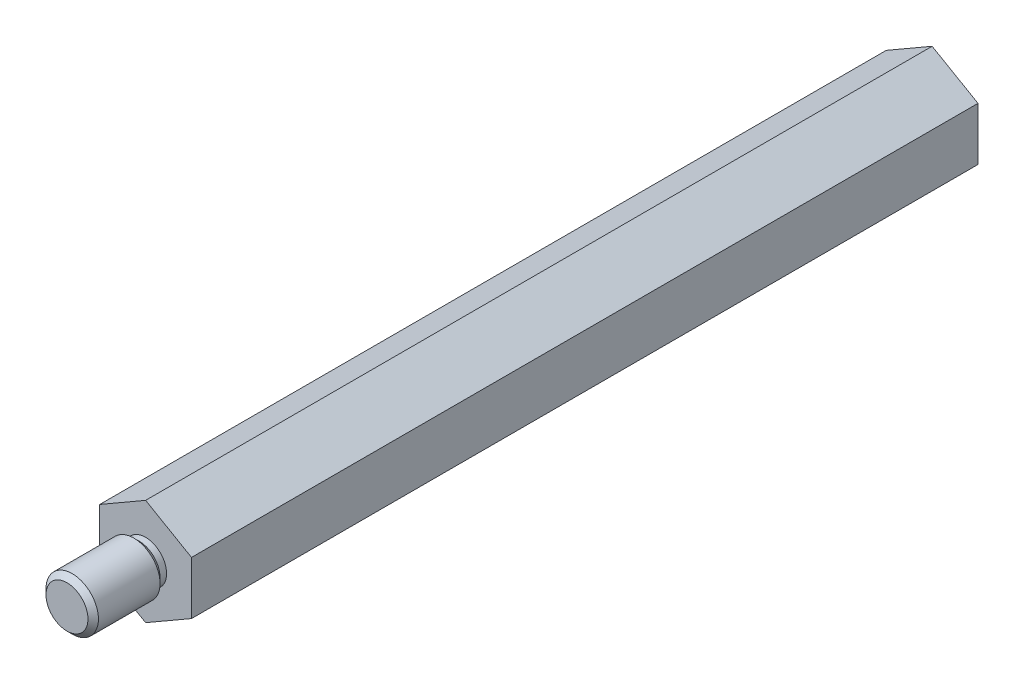
ISO-10303-21;
HEADER;
FILE_DESCRIPTION(('STEP AP214'),'2;1');
FILE_NAME('part.step','',(''),(''),'','','');
FILE_SCHEMA(('AUTOMOTIVE_DESIGN { 1 0 10303 214 1 1 1 1 }'));
ENDSEC;
DATA;
#1=APPLICATION_CONTEXT('core data for automotive mechanical design processes');
#2=APPLICATION_PROTOCOL_DEFINITION('international standard','automotive_design',2000,#1);
#3=PRODUCT_CONTEXT('',#1,'mechanical');
#4=PRODUCT('Part','Part','',(#3));
#5=PRODUCT_RELATED_PRODUCT_CATEGORY('part','',(#4));
#6=PRODUCT_DEFINITION_FORMATION('','',#4);
#7=PRODUCT_DEFINITION_CONTEXT('part definition',#1,'design');
#8=PRODUCT_DEFINITION('design','',#6,#7);
#9=PRODUCT_DEFINITION_SHAPE('','',#8);
#10=(LENGTH_UNIT() NAMED_UNIT(*) SI_UNIT(.MILLI.,.METRE.));
#11=(NAMED_UNIT(*) PLANE_ANGLE_UNIT() SI_UNIT($,.RADIAN.));
#12=(NAMED_UNIT(*) SI_UNIT($,.STERADIAN.) SOLID_ANGLE_UNIT());
#13=UNCERTAINTY_MEASURE_WITH_UNIT(LENGTH_MEASURE(1.E-05),#10,'distance_accuracy_value','');
#14=(GEOMETRIC_REPRESENTATION_CONTEXT(3) GLOBAL_UNCERTAINTY_ASSIGNED_CONTEXT((#13)) GLOBAL_UNIT_ASSIGNED_CONTEXT((#10,
#11,#12)) REPRESENTATION_CONTEXT('',''));
#15=CARTESIAN_POINT('',(0.,0.,0.));
#16=DIRECTION('',(0.,0.,1.));
#17=DIRECTION('',(1.,0.,0.));
#18=AXIS2_PLACEMENT_3D('',#15,#16,#17);
#19=CARTESIAN_POINT('',(0.,4.04145188432737,60.));
#20=DIRECTION('',(0.,0.,1.));
#21=DIRECTION('',(1.,0.,0.));
#22=AXIS2_PLACEMENT_3D('',#19,#20,#21);
#23=PLANE('',#22);
#24=DIRECTION('',(-0.866025403784438,0.5,0.));
#25=VECTOR('',#24,1.);
#26=CARTESIAN_POINT('',(3.49999999999999,2.02072594216368,60.));
#27=LINE('',#26,#25);
#28=CARTESIAN_POINT('',(3.49999999999999,2.02072594216368,60.));
#29=VERTEX_POINT('',#28);
#30=CARTESIAN_POINT('',(0.,4.04145188432737,60.));
#31=VERTEX_POINT('',#30);
#32=EDGE_CURVE('E131',#29,#31,#27,.T.);
#33=ORIENTED_EDGE('',*,*,#32,.T.);
#34=DIRECTION('',(-0.866025403784438,-0.5,0.));
#35=VECTOR('',#34,1.);
#36=CARTESIAN_POINT('',(0.,4.04145188432737,60.));
#37=LINE('',#36,#35);
#38=CARTESIAN_POINT('',(-3.5,2.02072594216368,60.));
#39=VERTEX_POINT('',#38);
#40=EDGE_CURVE('E88',#31,#39,#37,.T.);
#41=ORIENTED_EDGE('',*,*,#40,.T.);
#42=DIRECTION('',(0.,-1.,0.));
#43=VECTOR('',#42,1.);
#44=CARTESIAN_POINT('',(-3.5,2.02072594216368,60.));
#45=LINE('',#44,#43);
#46=CARTESIAN_POINT('',(-3.5,-2.0207259421637,60.));
#47=VERTEX_POINT('',#46);
#48=EDGE_CURVE('E102',#39,#47,#45,.T.);
#49=ORIENTED_EDGE('',*,*,#48,.T.);
#50=DIRECTION('',(0.866025403784438,-0.5,0.));
#51=VECTOR('',#50,1.);
#52=CARTESIAN_POINT('',(-3.5,-2.0207259421637,60.));
#53=LINE('',#52,#51);
#54=CARTESIAN_POINT('',(0.,-4.04145188432739,60.));
#55=VERTEX_POINT('',#54);
#56=EDGE_CURVE('E96',#47,#55,#53,.T.);
#57=ORIENTED_EDGE('',*,*,#56,.T.);
#58=DIRECTION('',(0.866025403784439,0.5,0.));
#59=VECTOR('',#58,1.);
#60=CARTESIAN_POINT('',(0.,-4.04145188432739,60.));
#61=LINE('',#60,#59);
#62=CARTESIAN_POINT('',(3.49999999999999,-2.0207259421637,60.));
#63=VERTEX_POINT('',#62);
#64=EDGE_CURVE('E100',#55,#63,#61,.T.);
#65=ORIENTED_EDGE('',*,*,#64,.T.);
#66=DIRECTION('',(0.,1.,0.));
#67=VECTOR('',#66,1.);
#68=CARTESIAN_POINT('',(3.49999999999999,-2.0207259421637,60.));
#69=LINE('',#68,#67);
#70=EDGE_CURVE('E49',#63,#29,#69,.T.);
#71=ORIENTED_EDGE('',*,*,#70,.T.);
#72=EDGE_LOOP('',(#33,#41,#49,#57,#65,#71));
#73=FACE_BOUND('',#72,.T.);
#74=CARTESIAN_POINT('',(0.,0.,60.));
#75=DIRECTION('',(0.,0.,1.));
#76=DIRECTION('',(1.,0.,0.));
#77=AXIS2_PLACEMENT_3D('',#74,#75,#76);
#78=CIRCLE('',#77,1.6);
#79=CARTESIAN_POINT('',(1.6,0.,60.));
#80=VERTEX_POINT('',#79);
#81=EDGE_CURVE('E198',#80,#80,#78,.T.);
#82=ORIENTED_EDGE('',*,*,#81,.F.);
#83=EDGE_LOOP('',(#82));
#84=FACE_BOUND('',#83,.T.);
#85=ADVANCED_FACE('F32',(#73,#84),#23,.T.);
#86=CARTESIAN_POINT('',(3.49999999999999,2.02072594216368,60.));
#87=DIRECTION('',(-0.5,-0.866025403784438,0.));
#88=DIRECTION('',(0.866025403784438,-0.5,0.));
#89=AXIS2_PLACEMENT_3D('',#86,#87,#88);
#90=PLANE('',#89);
#91=DIRECTION('',(-0.866025403784438,0.5,0.));
#92=VECTOR('',#91,1.);
#93=CARTESIAN_POINT('',(3.49999999999999,2.02072594216368,0.));
#94=LINE('',#93,#92);
#95=CARTESIAN_POINT('',(3.49999999999999,2.02072594216368,0.));
#96=VERTEX_POINT('',#95);
#97=CARTESIAN_POINT('',(0.,4.04145188432737,0.));
#98=VERTEX_POINT('',#97);
#99=EDGE_CURVE('E120',#96,#98,#94,.T.);
#100=ORIENTED_EDGE('',*,*,#99,.T.);
#101=DIRECTION('',(0.,0.,-1.));
#102=VECTOR('',#101,1.);
#103=CARTESIAN_POINT('',(0.,4.04145188432737,60.));
#104=LINE('',#103,#102);
#105=EDGE_CURVE('E138',#31,#98,#104,.T.);
#106=ORIENTED_EDGE('',*,*,#105,.F.);
#107=ORIENTED_EDGE('',*,*,#32,.F.);
#108=DIRECTION('',(0.,0.,-1.));
#109=VECTOR('',#108,1.);
#110=CARTESIAN_POINT('',(3.49999999999999,2.02072594216368,60.));
#111=LINE('',#110,#109);
#112=EDGE_CURVE('E116',#29,#96,#111,.T.);
#113=ORIENTED_EDGE('',*,*,#112,.T.);
#114=EDGE_LOOP('',(#100,#106,#107,#113));
#115=FACE_BOUND('',#114,.T.);
#116=ADVANCED_FACE('F162',(#115),#90,.F.);
#117=CARTESIAN_POINT('',(0.,4.04145188432737,60.));
#118=DIRECTION('',(0.5,-0.866025403784438,0.));
#119=DIRECTION('',(0.866025403784438,0.5,0.));
#120=AXIS2_PLACEMENT_3D('',#117,#118,#119);
#121=PLANE('',#120);
#122=DIRECTION('',(-0.866025403784438,-0.5,0.));
#123=VECTOR('',#122,1.);
#124=CARTESIAN_POINT('',(0.,4.04145188432737,0.));
#125=LINE('',#124,#123);
#126=CARTESIAN_POINT('',(-3.5,2.02072594216368,0.));
#127=VERTEX_POINT('',#126);
#128=EDGE_CURVE('E123',#98,#127,#125,.T.);
#129=ORIENTED_EDGE('',*,*,#128,.T.);
#130=DIRECTION('',(0.,0.,-1.));
#131=VECTOR('',#130,1.);
#132=CARTESIAN_POINT('',(-3.5,2.02072594216368,60.));
#133=LINE('',#132,#131);
#134=EDGE_CURVE('E135',#39,#127,#133,.T.);
#135=ORIENTED_EDGE('',*,*,#134,.F.);
#136=ORIENTED_EDGE('',*,*,#40,.F.);
#137=ORIENTED_EDGE('',*,*,#105,.T.);
#138=EDGE_LOOP('',(#129,#135,#136,#137));
#139=FACE_BOUND('',#138,.T.);
#140=ADVANCED_FACE('F167',(#139),#121,.F.);
#141=CARTESIAN_POINT('',(-3.5,2.02072594216368,60.));
#142=DIRECTION('',(1.,0.,0.));
#143=DIRECTION('',(0.,0.,-1.));
#144=AXIS2_PLACEMENT_3D('',#141,#142,#143);
#145=PLANE('',#144);
#146=DIRECTION('',(0.,-1.,0.));
#147=VECTOR('',#146,1.);
#148=CARTESIAN_POINT('',(-3.5,2.02072594216368,0.));
#149=LINE('',#148,#147);
#150=CARTESIAN_POINT('',(-3.5,-2.0207259421637,0.));
#151=VERTEX_POINT('',#150);
#152=EDGE_CURVE('E126',#127,#151,#149,.T.);
#153=ORIENTED_EDGE('',*,*,#152,.T.);
#154=DIRECTION('',(0.,0.,-1.));
#155=VECTOR('',#154,1.);
#156=CARTESIAN_POINT('',(-3.5,-2.0207259421637,60.));
#157=LINE('',#156,#155);
#158=EDGE_CURVE('E111',#47,#151,#157,.T.);
#159=ORIENTED_EDGE('',*,*,#158,.F.);
#160=ORIENTED_EDGE('',*,*,#48,.F.);
#161=ORIENTED_EDGE('',*,*,#134,.T.);
#162=EDGE_LOOP('',(#153,#159,#160,#161));
#163=FACE_BOUND('',#162,.T.);
#164=ADVANCED_FACE('F183',(#163),#145,.F.);
#165=CARTESIAN_POINT('',(-3.5,-2.0207259421637,60.));
#166=DIRECTION('',(0.5,0.866025403784439,0.));
#167=DIRECTION('',(-0.866025403784439,0.5,0.));
#168=AXIS2_PLACEMENT_3D('',#165,#166,#167);
#169=PLANE('',#168);
#170=DIRECTION('',(0.866025403784438,-0.5,0.));
#171=VECTOR('',#170,1.);
#172=CARTESIAN_POINT('',(-3.5,-2.0207259421637,0.));
#173=LINE('',#172,#171);
#174=CARTESIAN_POINT('',(0.,-4.04145188432739,0.));
#175=VERTEX_POINT('',#174);
#176=EDGE_CURVE('E110',#151,#175,#173,.T.);
#177=ORIENTED_EDGE('',*,*,#176,.T.);
#178=DIRECTION('',(0.,0.,-1.));
#179=VECTOR('',#178,1.);
#180=CARTESIAN_POINT('',(0.,-4.04145188432739,60.));
#181=LINE('',#180,#179);
#182=EDGE_CURVE('E107',#55,#175,#181,.T.);
#183=ORIENTED_EDGE('',*,*,#182,.F.);
#184=ORIENTED_EDGE('',*,*,#56,.F.);
#185=ORIENTED_EDGE('',*,*,#158,.T.);
#186=EDGE_LOOP('',(#177,#183,#184,#185));
#187=FACE_BOUND('',#186,.T.);
#188=ADVANCED_FACE('F108',(#187),#169,.F.);
#189=CARTESIAN_POINT('',(0.,-4.04145188432739,60.));
#190=DIRECTION('',(-0.5,0.866025403784439,0.));
#191=DIRECTION('',(-0.866025403784439,-0.5,0.));
#192=AXIS2_PLACEMENT_3D('',#189,#190,#191);
#193=PLANE('',#192);
#194=DIRECTION('',(0.866025403784439,0.5,0.));
#195=VECTOR('',#194,1.);
#196=CARTESIAN_POINT('',(0.,-4.04145188432739,0.));
#197=LINE('',#196,#195);
#198=CARTESIAN_POINT('',(3.49999999999999,-2.0207259421637,0.));
#199=VERTEX_POINT('',#198);
#200=EDGE_CURVE('E73',#175,#199,#197,.T.);
#201=ORIENTED_EDGE('',*,*,#200,.T.);
#202=DIRECTION('',(0.,0.,-1.));
#203=VECTOR('',#202,1.);
#204=CARTESIAN_POINT('',(3.49999999999999,-2.0207259421637,60.));
#205=LINE('',#204,#203);
#206=EDGE_CURVE('E112',#63,#199,#205,.T.);
#207=ORIENTED_EDGE('',*,*,#206,.F.);
#208=ORIENTED_EDGE('',*,*,#64,.F.);
#209=ORIENTED_EDGE('',*,*,#182,.T.);
#210=EDGE_LOOP('',(#201,#207,#208,#209));
#211=FACE_BOUND('',#210,.T.);
#212=ADVANCED_FACE('F114',(#211),#193,.F.);
#213=CARTESIAN_POINT('',(3.49999999999999,-2.0207259421637,60.));
#214=DIRECTION('',(-1.,0.,0.));
#215=DIRECTION('',(0.,-1.,0.));
#216=AXIS2_PLACEMENT_3D('',#213,#214,#215);
#217=PLANE('',#216);
#218=DIRECTION('',(0.,1.,0.));
#219=VECTOR('',#218,1.);
#220=CARTESIAN_POINT('',(3.49999999999999,-2.0207259421637,0.));
#221=LINE('',#220,#219);
#222=EDGE_CURVE('E79',#199,#96,#221,.T.);
#223=ORIENTED_EDGE('',*,*,#222,.T.);
#224=ORIENTED_EDGE('',*,*,#112,.F.);
#225=ORIENTED_EDGE('',*,*,#70,.F.);
#226=ORIENTED_EDGE('',*,*,#206,.T.);
#227=EDGE_LOOP('',(#223,#224,#225,#226));
#228=FACE_BOUND('',#227,.T.);
#229=ADVANCED_FACE('F175',(#228),#217,.F.);
#230=CARTESIAN_POINT('',(0.,4.04145188432737,0.));
#231=DIRECTION('',(0.,0.,1.));
#232=DIRECTION('',(1.,0.,0.));
#233=AXIS2_PLACEMENT_3D('',#230,#231,#232);
#234=PLANE('',#233);
#235=CARTESIAN_POINT('',(0.,0.,0.));
#236=DIRECTION('',(0.,0.,-1.));
#237=DIRECTION('',(-1.,0.,0.));
#238=AXIS2_PLACEMENT_3D('',#235,#236,#237);
#239=CIRCLE('',#238,2.);
#240=CARTESIAN_POINT('',(-2.,0.,0.));
#241=VERTEX_POINT('',#240);
#242=EDGE_CURVE('E201',#241,#241,#239,.T.);
#243=ORIENTED_EDGE('',*,*,#242,.F.);
#244=EDGE_LOOP('',(#243));
#245=FACE_BOUND('',#244,.T.);
#246=ORIENTED_EDGE('',*,*,#99,.F.);
#247=ORIENTED_EDGE('',*,*,#222,.F.);
#248=ORIENTED_EDGE('',*,*,#200,.F.);
#249=ORIENTED_EDGE('',*,*,#176,.F.);
#250=ORIENTED_EDGE('',*,*,#152,.F.);
#251=ORIENTED_EDGE('',*,*,#128,.F.);
#252=EDGE_LOOP('',(#246,#247,#248,#249,#250,#251));
#253=FACE_BOUND('',#252,.T.);
#254=ADVANCED_FACE('F171',(#245,#253),#234,.F.);
#255=CARTESIAN_POINT('',(0.,0.,60.5));
#256=DIRECTION('',(0.,0.,-1.));
#257=DIRECTION('',(-1.,0.,0.));
#258=AXIS2_PLACEMENT_3D('',#255,#256,#257);
#259=CYLINDRICAL_SURFACE('',#258,1.6);
#260=CARTESIAN_POINT('',(0.,0.,60.5));
#261=DIRECTION('',(0.,0.,1.));
#262=DIRECTION('',(1.,0.,0.));
#263=AXIS2_PLACEMENT_3D('',#260,#261,#262);
#264=CIRCLE('',#263,1.6);
#265=CARTESIAN_POINT('',(1.6,0.,60.5));
#266=VERTEX_POINT('',#265);
#267=EDGE_CURVE('E124',#266,#266,#264,.T.);
#268=ORIENTED_EDGE('',*,*,#267,.F.);
#269=EDGE_LOOP('',(#268));
#270=FACE_BOUND('',#269,.T.);
#271=ORIENTED_EDGE('',*,*,#81,.T.);
#272=EDGE_LOOP('',(#271));
#273=FACE_BOUND('',#272,.T.);
#274=ADVANCED_FACE('F174',(#270,#273),#259,.T.);
#275=CARTESIAN_POINT('',(0.,0.,66.));
#276=DIRECTION('',(0.,0.,1.));
#277=DIRECTION('',(1.,0.,0.));
#278=AXIS2_PLACEMENT_3D('',#275,#276,#277);
#279=PLANE('',#278);
#280=CARTESIAN_POINT('',(0.,0.,66.));
#281=DIRECTION('',(0.,0.,1.));
#282=DIRECTION('',(1.,0.,0.));
#283=AXIS2_PLACEMENT_3D('',#280,#281,#282);
#284=CIRCLE('',#283,1.6);
#285=CARTESIAN_POINT('',(1.6,0.,66.));
#286=VERTEX_POINT('',#285);
#287=EDGE_CURVE('E11',#286,#286,#284,.T.);
#288=ORIENTED_EDGE('',*,*,#287,.T.);
#289=EDGE_LOOP('',(#288));
#290=FACE_BOUND('',#289,.T.);
#291=ADVANCED_FACE('F157',(#290),#279,.T.);
#292=CARTESIAN_POINT('',(0.,0.,66.));
#293=DIRECTION('',(0.,0.,-1.));
#294=DIRECTION('',(-1.,0.,0.));
#295=AXIS2_PLACEMENT_3D('',#292,#293,#294);
#296=CYLINDRICAL_SURFACE('',#295,2.);
#297=CARTESIAN_POINT('',(0.,0.,60.9));
#298=DIRECTION('',(0.,0.,1.));
#299=DIRECTION('',(1.,0.,0.));
#300=AXIS2_PLACEMENT_3D('',#297,#298,#299);
#301=CIRCLE('',#300,2.);
#302=CARTESIAN_POINT('',(2.,0.,60.9));
#303=VERTEX_POINT('',#302);
#304=EDGE_CURVE('E41',#303,#303,#301,.T.);
#305=ORIENTED_EDGE('',*,*,#304,.T.);
#306=EDGE_LOOP('',(#305));
#307=FACE_BOUND('',#306,.T.);
#308=CARTESIAN_POINT('',(0.,0.,65.6));
#309=DIRECTION('',(0.,0.,1.));
#310=DIRECTION('',(1.,0.,0.));
#311=AXIS2_PLACEMENT_3D('',#308,#309,#310);
#312=CIRCLE('',#311,2.);
#313=CARTESIAN_POINT('',(2.,0.,65.6));
#314=VERTEX_POINT('',#313);
#315=EDGE_CURVE('E140',#314,#314,#312,.F.);
#316=ORIENTED_EDGE('',*,*,#315,.T.);
#317=EDGE_LOOP('',(#316));
#318=FACE_BOUND('',#317,.T.);
#319=ADVANCED_FACE('F145',(#307,#318),#296,.T.);
#320=CARTESIAN_POINT('',(0.,0.,60.9));
#321=DIRECTION('',(0.,0.,1.));
#322=DIRECTION('',(1.,0.,0.));
#323=AXIS2_PLACEMENT_3D('',#320,#321,#322);
#324=CONICAL_SURFACE('',#323,2.,0.785398163397443);
#325=ORIENTED_EDGE('',*,*,#267,.T.);
#326=EDGE_LOOP('',(#325));
#327=FACE_BOUND('',#326,.T.);
#328=ORIENTED_EDGE('',*,*,#304,.F.);
#329=EDGE_LOOP('',(#328));
#330=FACE_BOUND('',#329,.T.);
#331=ADVANCED_FACE('F148',(#327,#330),#324,.T.);
#332=CARTESIAN_POINT('',(0.,0.,66.));
#333=DIRECTION('',(0.,0.,-1.));
#334=DIRECTION('',(-1.,0.,0.));
#335=AXIS2_PLACEMENT_3D('',#332,#333,#334);
#336=CONICAL_SURFACE('',#335,1.6,0.785398163397449);
#337=ORIENTED_EDGE('',*,*,#315,.F.);
#338=EDGE_LOOP('',(#337));
#339=FACE_BOUND('',#338,.T.);
#340=ORIENTED_EDGE('',*,*,#287,.F.);
#341=EDGE_LOOP('',(#340));
#342=FACE_BOUND('',#341,.T.);
#343=ADVANCED_FACE('F34',(#339,#342),#336,.T.);
#344=CARTESIAN_POINT('',(0.,0.,0.));
#345=DIRECTION('',(0.,0.,-1.));
#346=DIRECTION('',(-1.,0.,0.));
#347=AXIS2_PLACEMENT_3D('',#344,#345,#346);
#348=CONICAL_SURFACE('',#347,2.,0.785398163397449);
#349=CARTESIAN_POINT('',(0.,0.,0.4));
#350=DIRECTION('',(0.,0.,-1.));
#351=DIRECTION('',(-1.,0.,0.));
#352=AXIS2_PLACEMENT_3D('',#349,#350,#351);
#353=CIRCLE('',#352,1.6);
#354=CARTESIAN_POINT('',(-1.6,0.,0.4));
#355=VERTEX_POINT('',#354);
#356=EDGE_CURVE('E205',#355,#355,#353,.T.);
#357=ORIENTED_EDGE('',*,*,#356,.F.);
#358=EDGE_LOOP('',(#357));
#359=FACE_BOUND('',#358,.T.);
#360=ORIENTED_EDGE('',*,*,#242,.T.);
#361=EDGE_LOOP('',(#360));
#362=FACE_BOUND('',#361,.T.);
#363=ADVANCED_FACE('F155',(#359,#362),#348,.F.);
#364=CARTESIAN_POINT('',(0.,0.,0.));
#365=DIRECTION('',(0.,0.,-1.));
#366=DIRECTION('',(-1.,0.,0.));
#367=AXIS2_PLACEMENT_3D('',#364,#365,#366);
#368=CYLINDRICAL_SURFACE('',#367,1.6);
#369=CARTESIAN_POINT('',(0.,0.,10.));
#370=DIRECTION('',(0.,0.,-1.));
#371=DIRECTION('',(-1.,0.,0.));
#372=AXIS2_PLACEMENT_3D('',#369,#370,#371);
#373=CIRCLE('',#372,1.6);
#374=CARTESIAN_POINT('',(-1.6,0.,10.));
#375=VERTEX_POINT('',#374);
#376=EDGE_CURVE('E208',#375,#375,#373,.T.);
#377=ORIENTED_EDGE('',*,*,#376,.F.);
#378=EDGE_LOOP('',(#377));
#379=FACE_BOUND('',#378,.T.);
#380=ORIENTED_EDGE('',*,*,#356,.T.);
#381=EDGE_LOOP('',(#380));
#382=FACE_BOUND('',#381,.T.);
#383=ADVANCED_FACE('F214',(#379,#382),#368,.F.);
#384=CARTESIAN_POINT('',(0.,0.,10.));
#385=DIRECTION('',(0.,0.,-1.));
#386=DIRECTION('',(-1.,0.,0.));
#387=AXIS2_PLACEMENT_3D('',#384,#385,#386);
#388=CONICAL_SURFACE('',#387,1.6,1.02974425867665);
#389=CARTESIAN_POINT('',(0.,0.,10.9613769904441));
#390=VERTEX_POINT('',#389);
#391=VERTEX_LOOP('',#390);
#392=FACE_BOUND('',#391,.T.);
#393=ORIENTED_EDGE('',*,*,#376,.T.);
#394=EDGE_LOOP('',(#393));
#395=FACE_BOUND('',#394,.T.);
#396=ADVANCED_FACE('F212',(#392,#395),#388,.F.);
#397=CLOSED_SHELL('',(#85,#116,#140,#164,#188,#212,#229,#254,#274,#291,#319,#331,#343,#363,#383,#396));
#398=MANIFOLD_SOLID_BREP('B2',#397);
#399=ADVANCED_BREP_SHAPE_REPRESENTATION('',(#18,#398),#14);
#400=SHAPE_DEFINITION_REPRESENTATION(#9,#399);
ENDSEC;
END-ISO-10303-21;
